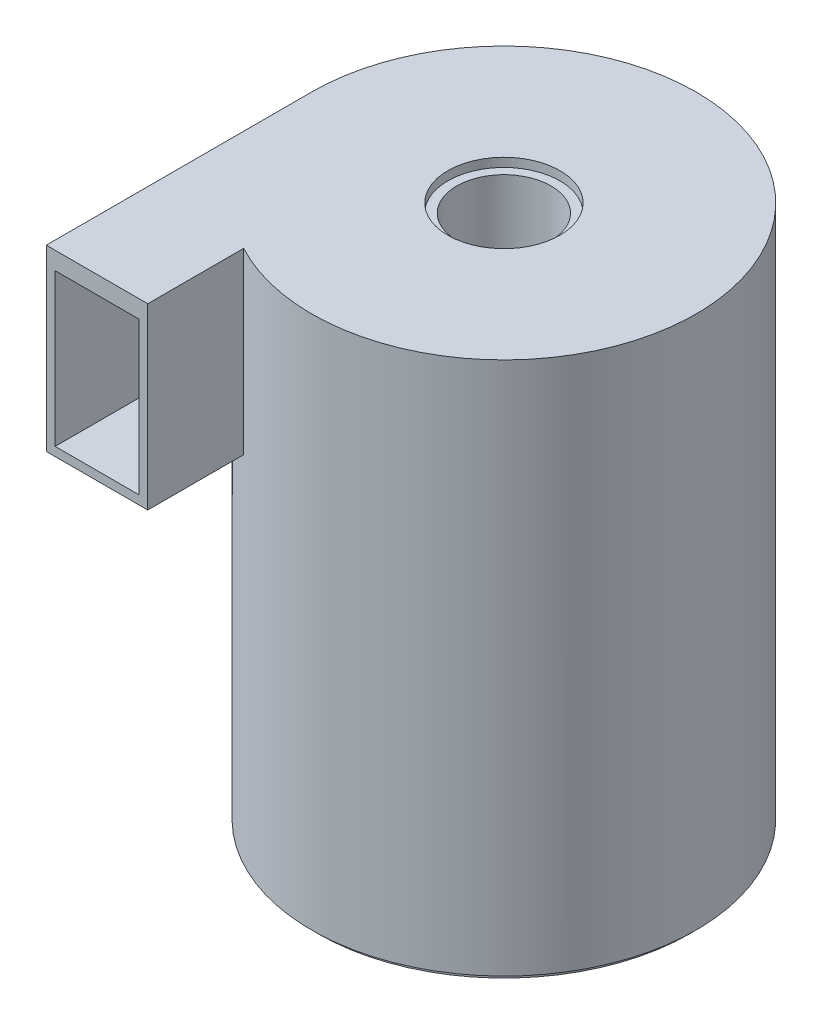
ISO-10303-21;
HEADER;
FILE_DESCRIPTION(('STEP AP214'),'2;1');
FILE_NAME('part.step','',(''),(''),'','','');
FILE_SCHEMA(('AUTOMOTIVE_DESIGN { 1 0 10303 214 1 1 1 1 }'));
ENDSEC;
DATA;
#1=APPLICATION_CONTEXT('core data for automotive mechanical design processes');
#2=APPLICATION_PROTOCOL_DEFINITION('international standard','automotive_design',2000,#1);
#3=PRODUCT_CONTEXT('',#1,'mechanical');
#4=PRODUCT('Part','Part','',(#3));
#5=PRODUCT_RELATED_PRODUCT_CATEGORY('part','',(#4));
#6=PRODUCT_DEFINITION_FORMATION('','',#4);
#7=PRODUCT_DEFINITION_CONTEXT('part definition',#1,'design');
#8=PRODUCT_DEFINITION('design','',#6,#7);
#9=PRODUCT_DEFINITION_SHAPE('','',#8);
#10=(LENGTH_UNIT() NAMED_UNIT(*) SI_UNIT(.MILLI.,.METRE.));
#11=(NAMED_UNIT(*) PLANE_ANGLE_UNIT() SI_UNIT($,.RADIAN.));
#12=(NAMED_UNIT(*) SI_UNIT($,.STERADIAN.) SOLID_ANGLE_UNIT());
#13=UNCERTAINTY_MEASURE_WITH_UNIT(LENGTH_MEASURE(1.E-05),#10,'distance_accuracy_value','');
#14=(GEOMETRIC_REPRESENTATION_CONTEXT(3) GLOBAL_UNCERTAINTY_ASSIGNED_CONTEXT((#13)) GLOBAL_UNIT_ASSIGNED_CONTEXT((#10,
#11,#12)) REPRESENTATION_CONTEXT('',''));
#15=CARTESIAN_POINT('',(0.,0.,0.));
#16=DIRECTION('',(0.,0.,1.));
#17=DIRECTION('',(1.,0.,0.));
#18=AXIS2_PLACEMENT_3D('',#15,#16,#17);
#19=CARTESIAN_POINT('',(0.,0.,0.));
#20=DIRECTION('',(0.,-1.,0.));
#21=DIRECTION('',(0.,0.,-1.));
#22=AXIS2_PLACEMENT_3D('',#19,#20,#21);
#23=CYLINDRICAL_SURFACE('',#22,65.2);
#24=DIRECTION('',(0.,-1.,0.));
#25=VECTOR('',#24,1.);
#26=CARTESIAN_POINT('',(-65.2,180.,0.));
#27=LINE('',#26,#25);
#28=CARTESIAN_POINT('',(-65.2,183.,0.));
#29=VERTEX_POINT('',#28);
#30=CARTESIAN_POINT('',(-65.2,122.4,0.));
#31=VERTEX_POINT('',#30);
#32=EDGE_CURVE('E211',#29,#31,#27,.T.);
#33=ORIENTED_EDGE('',*,*,#32,.F.);
#34=CARTESIAN_POINT('',(0.,183.,0.));
#35=DIRECTION('',(0.,1.,0.));
#36=DIRECTION('',(0.,0.,1.));
#37=AXIS2_PLACEMENT_3D('',#34,#35,#36);
#38=CIRCLE('',#37,65.2);
#39=CARTESIAN_POINT('',(-30.8,183.,57.4665119874175));
#40=VERTEX_POINT('',#39);
#41=EDGE_CURVE('E136',#40,#29,#38,.T.);
#42=ORIENTED_EDGE('',*,*,#41,.F.);
#43=DIRECTION('',(0.,-1.,0.));
#44=VECTOR('',#43,1.);
#45=CARTESIAN_POINT('',(-30.8,0.,57.4665119874175));
#46=LINE('',#45,#44);
#47=CARTESIAN_POINT('',(-30.8,122.4,57.4665119874176));
#48=VERTEX_POINT('',#47);
#49=EDGE_CURVE('E12',#40,#48,#46,.T.);
#50=ORIENTED_EDGE('',*,*,#49,.T.);
#51=CARTESIAN_POINT('',(0.,122.4,0.));
#52=DIRECTION('',(0.,1.,0.));
#53=DIRECTION('',(0.,0.,1.));
#54=AXIS2_PLACEMENT_3D('',#51,#52,#53);
#55=CIRCLE('',#54,65.2);
#56=EDGE_CURVE('E60',#48,#31,#55,.F.);
#57=ORIENTED_EDGE('',*,*,#56,.T.);
#58=EDGE_LOOP('',(#33,#42,#50,#57));
#59=FACE_BOUND('',#58,.T.);
#60=CARTESIAN_POINT('',(0.,2.,0.));
#61=DIRECTION('',(0.,-1.,0.));
#62=DIRECTION('',(0.,0.,-1.));
#63=AXIS2_PLACEMENT_3D('',#60,#61,#62);
#64=CIRCLE('',#63,65.2);
#65=CARTESIAN_POINT('',(0.,2.,-65.2));
#66=VERTEX_POINT('',#65);
#67=EDGE_CURVE('E264',#66,#66,#64,.T.);
#68=ORIENTED_EDGE('',*,*,#67,.F.);
#69=EDGE_LOOP('',(#68));
#70=FACE_BOUND('',#69,.T.);
#71=ADVANCED_FACE('F50',(#59,#70),#23,.T.);
#72=CARTESIAN_POINT('',(65.2,0.,0.));
#73=DIRECTION('',(0.,-1.,0.));
#74=DIRECTION('',(0.,0.,-1.));
#75=AXIS2_PLACEMENT_3D('',#72,#73,#74);
#76=PLANE('',#75);
#77=CARTESIAN_POINT('',(0.,0.,0.));
#78=DIRECTION('',(0.,-1.,0.));
#79=DIRECTION('',(0.,0.,-1.));
#80=AXIS2_PLACEMENT_3D('',#77,#78,#79);
#81=CIRCLE('',#80,62.2);
#82=CARTESIAN_POINT('',(0.,0.,-62.2));
#83=VERTEX_POINT('',#82);
#84=EDGE_CURVE('E161',#83,#83,#81,.T.);
#85=ORIENTED_EDGE('',*,*,#84,.F.);
#86=EDGE_LOOP('',(#85));
#87=FACE_BOUND('',#86,.T.);
#88=CARTESIAN_POINT('',(0.,0.,0.));
#89=DIRECTION('',(0.,-1.,0.));
#90=DIRECTION('',(0.,0.,-1.));
#91=AXIS2_PLACEMENT_3D('',#88,#89,#90);
#92=CIRCLE('',#91,63.2);
#93=CARTESIAN_POINT('',(0.,0.,-63.2));
#94=VERTEX_POINT('',#93);
#95=EDGE_CURVE('E256',#94,#94,#92,.T.);
#96=ORIENTED_EDGE('',*,*,#95,.T.);
#97=EDGE_LOOP('',(#96));
#98=FACE_BOUND('',#97,.T.);
#99=ADVANCED_FACE('F242',(#87,#98),#76,.T.);
#100=CARTESIAN_POINT('',(0.,0.,0.));
#101=DIRECTION('',(0.,-1.,0.));
#102=DIRECTION('',(0.,0.,-1.));
#103=AXIS2_PLACEMENT_3D('',#100,#101,#102);
#104=CYLINDRICAL_SURFACE('',#103,16.);
#105=CARTESIAN_POINT('',(0.,36.,0.));
#106=DIRECTION('',(0.,-1.,0.));
#107=DIRECTION('',(0.,0.,-1.));
#108=AXIS2_PLACEMENT_3D('',#105,#106,#107);
#109=CIRCLE('',#108,16.);
#110=CARTESIAN_POINT('',(0.,36.,-16.));
#111=VERTEX_POINT('',#110);
#112=EDGE_CURVE('E166',#111,#111,#109,.T.);
#113=ORIENTED_EDGE('',*,*,#112,.T.);
#114=EDGE_LOOP('',(#113));
#115=FACE_BOUND('',#114,.T.);
#116=CARTESIAN_POINT('',(0.,180.,0.));
#117=DIRECTION('',(0.,1.,0.));
#118=DIRECTION('',(0.,0.,1.));
#119=AXIS2_PLACEMENT_3D('',#116,#117,#118);
#120=CIRCLE('',#119,16.);
#121=CARTESIAN_POINT('',(0.,180.,16.));
#122=VERTEX_POINT('',#121);
#123=EDGE_CURVE('E54',#122,#122,#120,.T.);
#124=ORIENTED_EDGE('',*,*,#123,.T.);
#125=EDGE_LOOP('',(#124));
#126=FACE_BOUND('',#125,.T.);
#127=ADVANCED_FACE('F52',(#115,#126),#104,.F.);
#128=CARTESIAN_POINT('',(-65.2,180.,90.));
#129=DIRECTION('',(1.,0.,0.));
#130=DIRECTION('',(0.,0.,-1.));
#131=AXIS2_PLACEMENT_3D('',#128,#129,#130);
#132=PLANE('',#131);
#133=ORIENTED_EDGE('',*,*,#32,.T.);
#134=DIRECTION('',(0.,0.,-1.));
#135=VECTOR('',#134,1.);
#136=CARTESIAN_POINT('',(-65.2,122.4,90.));
#137=LINE('',#136,#135);
#138=CARTESIAN_POINT('',(-65.2,122.4,90.));
#139=VERTEX_POINT('',#138);
#140=EDGE_CURVE('E219',#139,#31,#137,.T.);
#141=ORIENTED_EDGE('',*,*,#140,.F.);
#142=DIRECTION('',(0.,-1.,0.));
#143=VECTOR('',#142,1.);
#144=CARTESIAN_POINT('',(-65.2,180.,90.));
#145=LINE('',#144,#143);
#146=CARTESIAN_POINT('',(-65.2,183.,90.));
#147=VERTEX_POINT('',#146);
#148=EDGE_CURVE('E208',#147,#139,#145,.T.);
#149=ORIENTED_EDGE('',*,*,#148,.F.);
#150=DIRECTION('',(0.,0.,1.));
#151=VECTOR('',#150,1.);
#152=CARTESIAN_POINT('',(-65.2,183.,0.));
#153=LINE('',#152,#151);
#154=EDGE_CURVE('E141',#29,#147,#153,.T.);
#155=ORIENTED_EDGE('',*,*,#154,.F.);
#156=EDGE_LOOP('',(#133,#141,#149,#155));
#157=FACE_BOUND('',#156,.T.);
#158=ADVANCED_FACE('F230',(#157),#132,.F.);
#159=CARTESIAN_POINT('',(-65.2,122.4,90.));
#160=DIRECTION('',(0.,1.,0.));
#161=DIRECTION('',(0.,0.,1.));
#162=AXIS2_PLACEMENT_3D('',#159,#160,#161);
#163=PLANE('',#162);
#164=ORIENTED_EDGE('',*,*,#56,.F.);
#165=DIRECTION('',(0.,0.,-1.));
#166=VECTOR('',#165,1.);
#167=CARTESIAN_POINT('',(-30.8,122.4,90.));
#168=LINE('',#167,#166);
#169=CARTESIAN_POINT('',(-30.8,122.4,90.));
#170=VERTEX_POINT('',#169);
#171=EDGE_CURVE('E127',#170,#48,#168,.T.);
#172=ORIENTED_EDGE('',*,*,#171,.F.);
#173=DIRECTION('',(1.,0.,0.));
#174=VECTOR('',#173,1.);
#175=CARTESIAN_POINT('',(-65.2,122.4,90.));
#176=LINE('',#175,#174);
#177=EDGE_CURVE('E124',#139,#170,#176,.T.);
#178=ORIENTED_EDGE('',*,*,#177,.F.);
#179=ORIENTED_EDGE('',*,*,#140,.T.);
#180=EDGE_LOOP('',(#164,#172,#178,#179));
#181=FACE_BOUND('',#180,.T.);
#182=ADVANCED_FACE('F232',(#181),#163,.F.);
#183=CARTESIAN_POINT('',(-30.8,180.,90.));
#184=DIRECTION('',(-1.,0.,0.));
#185=DIRECTION('',(0.,-1.,0.));
#186=AXIS2_PLACEMENT_3D('',#183,#184,#185);
#187=PLANE('',#186);
#188=ORIENTED_EDGE('',*,*,#49,.F.);
#189=DIRECTION('',(0.,0.,-1.));
#190=VECTOR('',#189,1.);
#191=CARTESIAN_POINT('',(-30.8,183.,90.));
#192=LINE('',#191,#190);
#193=CARTESIAN_POINT('',(-30.8,183.,90.));
#194=VERTEX_POINT('',#193);
#195=EDGE_CURVE('E130',#194,#40,#192,.T.);
#196=ORIENTED_EDGE('',*,*,#195,.F.);
#197=DIRECTION('',(0.,1.,0.));
#198=VECTOR('',#197,1.);
#199=CARTESIAN_POINT('',(-30.8,180.,90.));
#200=LINE('',#199,#198);
#201=EDGE_CURVE('E118',#170,#194,#200,.T.);
#202=ORIENTED_EDGE('',*,*,#201,.F.);
#203=ORIENTED_EDGE('',*,*,#171,.T.);
#204=EDGE_LOOP('',(#188,#196,#202,#203));
#205=FACE_BOUND('',#204,.T.);
#206=ADVANCED_FACE('F131',(#205),#187,.F.);
#207=CARTESIAN_POINT('',(0.,0.,90.));
#208=DIRECTION('',(0.,0.,1.));
#209=DIRECTION('',(1.,0.,0.));
#210=AXIS2_PLACEMENT_3D('',#207,#208,#209);
#211=PLANE('',#210);
#212=DIRECTION('',(0.,-1.,0.));
#213=VECTOR('',#212,1.);
#214=CARTESIAN_POINT('',(-62.2,180.,90.));
#215=LINE('',#214,#213);
#216=CARTESIAN_POINT('',(-62.2,177.,90.));
#217=VERTEX_POINT('',#216);
#218=CARTESIAN_POINT('',(-62.2,125.4,90.));
#219=VERTEX_POINT('',#218);
#220=EDGE_CURVE('E175',#217,#219,#215,.T.);
#221=ORIENTED_EDGE('',*,*,#220,.F.);
#222=DIRECTION('',(-1.,0.,0.));
#223=VECTOR('',#222,1.);
#224=CARTESIAN_POINT('',(0.,177.,90.));
#225=LINE('',#224,#223);
#226=CARTESIAN_POINT('',(-33.8,177.,90.));
#227=VERTEX_POINT('',#226);
#228=EDGE_CURVE('E182',#227,#217,#225,.T.);
#229=ORIENTED_EDGE('',*,*,#228,.F.);
#230=DIRECTION('',(0.,1.,0.));
#231=VECTOR('',#230,1.);
#232=CARTESIAN_POINT('',(-33.8,180.,90.));
#233=LINE('',#232,#231);
#234=CARTESIAN_POINT('',(-33.8,125.4,90.));
#235=VERTEX_POINT('',#234);
#236=EDGE_CURVE('E197',#235,#227,#233,.T.);
#237=ORIENTED_EDGE('',*,*,#236,.F.);
#238=DIRECTION('',(1.,0.,0.));
#239=VECTOR('',#238,1.);
#240=CARTESIAN_POINT('',(-65.2,125.4,90.));
#241=LINE('',#240,#239);
#242=EDGE_CURVE('E200',#219,#235,#241,.T.);
#243=ORIENTED_EDGE('',*,*,#242,.F.);
#244=EDGE_LOOP('',(#221,#229,#237,#243));
#245=FACE_BOUND('',#244,.T.);
#246=ORIENTED_EDGE('',*,*,#148,.T.);
#247=ORIENTED_EDGE('',*,*,#177,.T.);
#248=ORIENTED_EDGE('',*,*,#201,.T.);
#249=DIRECTION('',(1.,0.,0.));
#250=VECTOR('',#249,1.);
#251=CARTESIAN_POINT('',(-65.2,183.,90.));
#252=LINE('',#251,#250);
#253=EDGE_CURVE('E123',#147,#194,#252,.T.);
#254=ORIENTED_EDGE('',*,*,#253,.F.);
#255=EDGE_LOOP('',(#246,#247,#248,#254));
#256=FACE_BOUND('',#255,.T.);
#257=ADVANCED_FACE('F121',(#245,#256),#211,.T.);
#258=CARTESIAN_POINT('',(0.,36.,0.));
#259=DIRECTION('',(0.,1.,0.));
#260=DIRECTION('',(0.,0.,1.));
#261=AXIS2_PLACEMENT_3D('',#258,#259,#260);
#262=PLANE('',#261);
#263=CARTESIAN_POINT('',(0.,36.,0.));
#264=DIRECTION('',(0.,1.,0.));
#265=DIRECTION('',(0.,0.,1.));
#266=AXIS2_PLACEMENT_3D('',#263,#264,#265);
#267=CIRCLE('',#266,19.);
#268=CARTESIAN_POINT('',(0.,36.,19.));
#269=VERTEX_POINT('',#268);
#270=EDGE_CURVE('E171',#269,#269,#267,.F.);
#271=ORIENTED_EDGE('',*,*,#270,.T.);
#272=EDGE_LOOP('',(#271));
#273=FACE_BOUND('',#272,.T.);
#274=ORIENTED_EDGE('',*,*,#112,.F.);
#275=EDGE_LOOP('',(#274));
#276=FACE_BOUND('',#275,.T.);
#277=ADVANCED_FACE('F296',(#273,#276),#262,.F.);
#278=CARTESIAN_POINT('',(0.,0.,0.));
#279=DIRECTION('',(0.,-1.,0.));
#280=DIRECTION('',(0.,0.,-1.));
#281=AXIS2_PLACEMENT_3D('',#278,#279,#280);
#282=CYLINDRICAL_SURFACE('',#281,62.2);
#283=ORIENTED_EDGE('',*,*,#84,.T.);
#284=EDGE_LOOP('',(#283));
#285=FACE_BOUND('',#284,.T.);
#286=CARTESIAN_POINT('',(0.,177.,0.));
#287=DIRECTION('',(0.,1.,0.));
#288=DIRECTION('',(0.,0.,1.));
#289=AXIS2_PLACEMENT_3D('',#286,#287,#288);
#290=CIRCLE('',#289,62.2);
#291=CARTESIAN_POINT('',(-62.2,177.,0.));
#292=VERTEX_POINT('',#291);
#293=CARTESIAN_POINT('',(-33.8,177.,52.2149403906583));
#294=VERTEX_POINT('',#293);
#295=EDGE_CURVE('E157',#292,#294,#290,.F.);
#296=ORIENTED_EDGE('',*,*,#295,.F.);
#297=DIRECTION('',(0.,1.,0.));
#298=VECTOR('',#297,1.);
#299=CARTESIAN_POINT('',(-62.2,180.,0.));
#300=LINE('',#299,#298);
#301=CARTESIAN_POINT('',(-62.2,125.4,0.));
#302=VERTEX_POINT('',#301);
#303=EDGE_CURVE('E156',#292,#302,#300,.F.);
#304=ORIENTED_EDGE('',*,*,#303,.T.);
#305=CARTESIAN_POINT('',(0.,125.4,0.));
#306=DIRECTION('',(0.,1.,0.));
#307=DIRECTION('',(0.,0.,1.));
#308=AXIS2_PLACEMENT_3D('',#305,#306,#307);
#309=CIRCLE('',#308,62.2);
#310=CARTESIAN_POINT('',(-33.8,125.4,52.2149403906583));
#311=VERTEX_POINT('',#310);
#312=EDGE_CURVE('E167',#311,#302,#309,.F.);
#313=ORIENTED_EDGE('',*,*,#312,.F.);
#314=DIRECTION('',(0.,-1.,0.));
#315=VECTOR('',#314,1.);
#316=CARTESIAN_POINT('',(-33.8,177.,52.2149403906583));
#317=LINE('',#316,#315);
#318=EDGE_CURVE('E162',#294,#311,#317,.T.);
#319=ORIENTED_EDGE('',*,*,#318,.F.);
#320=EDGE_LOOP('',(#296,#304,#313,#319));
#321=FACE_BOUND('',#320,.T.);
#322=ADVANCED_FACE('F299',(#285,#321),#282,.F.);
#323=CARTESIAN_POINT('',(0.,0.,0.));
#324=DIRECTION('',(0.,-1.,0.));
#325=DIRECTION('',(0.,0.,-1.));
#326=AXIS2_PLACEMENT_3D('',#323,#324,#325);
#327=CYLINDRICAL_SURFACE('',#326,19.);
#328=ORIENTED_EDGE('',*,*,#270,.F.);
#329=EDGE_LOOP('',(#328));
#330=FACE_BOUND('',#329,.T.);
#331=CARTESIAN_POINT('',(0.,177.,0.));
#332=DIRECTION('',(0.,1.,0.));
#333=DIRECTION('',(0.,0.,1.));
#334=AXIS2_PLACEMENT_3D('',#331,#332,#333);
#335=CIRCLE('',#334,19.);
#336=CARTESIAN_POINT('',(0.,177.,19.));
#337=VERTEX_POINT('',#336);
#338=EDGE_CURVE('E160',#337,#337,#335,.F.);
#339=ORIENTED_EDGE('',*,*,#338,.T.);
#340=EDGE_LOOP('',(#339));
#341=FACE_BOUND('',#340,.T.);
#342=ADVANCED_FACE('F303',(#330,#341),#327,.T.);
#343=CARTESIAN_POINT('',(16.,177.,0.));
#344=DIRECTION('',(0.,1.,0.));
#345=DIRECTION('',(0.,0.,1.));
#346=AXIS2_PLACEMENT_3D('',#343,#344,#345);
#347=PLANE('',#346);
#348=DIRECTION('',(0.,0.,-1.));
#349=VECTOR('',#348,1.);
#350=CARTESIAN_POINT('',(-33.8,177.,90.));
#351=LINE('',#350,#349);
#352=EDGE_CURVE('E67',#227,#294,#351,.T.);
#353=ORIENTED_EDGE('',*,*,#352,.F.);
#354=ORIENTED_EDGE('',*,*,#228,.T.);
#355=DIRECTION('',(0.,0.,-1.));
#356=VECTOR('',#355,1.);
#357=CARTESIAN_POINT('',(-62.2,177.,0.));
#358=LINE('',#357,#356);
#359=EDGE_CURVE('E179',#217,#292,#358,.T.);
#360=ORIENTED_EDGE('',*,*,#359,.T.);
#361=ORIENTED_EDGE('',*,*,#295,.T.);
#362=EDGE_LOOP('',(#353,#354,#360,#361));
#363=FACE_BOUND('',#362,.T.);
#364=ORIENTED_EDGE('',*,*,#338,.F.);
#365=EDGE_LOOP('',(#364));
#366=FACE_BOUND('',#365,.T.);
#367=ADVANCED_FACE('F307',(#363,#366),#347,.F.);
#368=CARTESIAN_POINT('',(-62.2,180.,90.));
#369=DIRECTION('',(1.,0.,0.));
#370=DIRECTION('',(0.,0.,-1.));
#371=AXIS2_PLACEMENT_3D('',#368,#369,#370);
#372=PLANE('',#371);
#373=ORIENTED_EDGE('',*,*,#303,.F.);
#374=ORIENTED_EDGE('',*,*,#359,.F.);
#375=ORIENTED_EDGE('',*,*,#220,.T.);
#376=DIRECTION('',(0.,0.,-1.));
#377=VECTOR('',#376,1.);
#378=CARTESIAN_POINT('',(-62.2,125.4,90.));
#379=LINE('',#378,#377);
#380=EDGE_CURVE('E186',#219,#302,#379,.T.);
#381=ORIENTED_EDGE('',*,*,#380,.T.);
#382=EDGE_LOOP('',(#373,#374,#375,#381));
#383=FACE_BOUND('',#382,.T.);
#384=ADVANCED_FACE('F311',(#383),#372,.T.);
#385=CARTESIAN_POINT('',(-65.2,125.4,90.));
#386=DIRECTION('',(0.,1.,0.));
#387=DIRECTION('',(0.,0.,1.));
#388=AXIS2_PLACEMENT_3D('',#385,#386,#387);
#389=PLANE('',#388);
#390=ORIENTED_EDGE('',*,*,#312,.T.);
#391=ORIENTED_EDGE('',*,*,#380,.F.);
#392=ORIENTED_EDGE('',*,*,#242,.T.);
#393=DIRECTION('',(0.,0.,-1.));
#394=VECTOR('',#393,1.);
#395=CARTESIAN_POINT('',(-33.8,125.4,90.));
#396=LINE('',#395,#394);
#397=EDGE_CURVE('E178',#235,#311,#396,.T.);
#398=ORIENTED_EDGE('',*,*,#397,.T.);
#399=EDGE_LOOP('',(#390,#391,#392,#398));
#400=FACE_BOUND('',#399,.T.);
#401=ADVANCED_FACE('F291',(#400),#389,.T.);
#402=CARTESIAN_POINT('',(-33.8,180.,90.));
#403=DIRECTION('',(-1.,0.,0.));
#404=DIRECTION('',(0.,-1.,0.));
#405=AXIS2_PLACEMENT_3D('',#402,#403,#404);
#406=PLANE('',#405);
#407=ORIENTED_EDGE('',*,*,#318,.T.);
#408=ORIENTED_EDGE('',*,*,#397,.F.);
#409=ORIENTED_EDGE('',*,*,#236,.T.);
#410=ORIENTED_EDGE('',*,*,#352,.T.);
#411=EDGE_LOOP('',(#407,#408,#409,#410));
#412=FACE_BOUND('',#411,.T.);
#413=ADVANCED_FACE('F282',(#412),#406,.T.);
#414=CARTESIAN_POINT('',(0.,183.,0.));
#415=DIRECTION('',(0.,1.,0.));
#416=DIRECTION('',(0.,0.,1.));
#417=AXIS2_PLACEMENT_3D('',#414,#415,#416);
#418=PLANE('',#417);
#419=CARTESIAN_POINT('',(0.,183.,0.));
#420=DIRECTION('',(0.,1.,0.));
#421=DIRECTION('',(0.,0.,1.));
#422=AXIS2_PLACEMENT_3D('',#419,#420,#421);
#423=CIRCLE('',#422,19.);
#424=CARTESIAN_POINT('',(0.,183.,19.));
#425=VERTEX_POINT('',#424);
#426=EDGE_CURVE('E149',#425,#425,#423,.T.);
#427=ORIENTED_EDGE('',*,*,#426,.F.);
#428=EDGE_LOOP('',(#427));
#429=FACE_BOUND('',#428,.T.);
#430=ORIENTED_EDGE('',*,*,#253,.T.);
#431=ORIENTED_EDGE('',*,*,#195,.T.);
#432=ORIENTED_EDGE('',*,*,#41,.T.);
#433=ORIENTED_EDGE('',*,*,#154,.T.);
#434=EDGE_LOOP('',(#430,#431,#432,#433));
#435=FACE_BOUND('',#434,.T.);
#436=ADVANCED_FACE('F139',(#429,#435),#418,.T.);
#437=CARTESIAN_POINT('',(0.,180.,0.));
#438=DIRECTION('',(0.,1.,0.));
#439=DIRECTION('',(0.,0.,1.));
#440=AXIS2_PLACEMENT_3D('',#437,#438,#439);
#441=CYLINDRICAL_SURFACE('',#440,19.);
#442=CARTESIAN_POINT('',(0.,180.,0.));
#443=DIRECTION('',(0.,1.,0.));
#444=DIRECTION('',(0.,0.,1.));
#445=AXIS2_PLACEMENT_3D('',#442,#443,#444);
#446=CIRCLE('',#445,19.);
#447=CARTESIAN_POINT('',(0.,180.,19.));
#448=VERTEX_POINT('',#447);
#449=EDGE_CURVE('E147',#448,#448,#446,.T.);
#450=ORIENTED_EDGE('',*,*,#449,.F.);
#451=EDGE_LOOP('',(#450));
#452=FACE_BOUND('',#451,.T.);
#453=ORIENTED_EDGE('',*,*,#426,.T.);
#454=EDGE_LOOP('',(#453));
#455=FACE_BOUND('',#454,.T.);
#456=ADVANCED_FACE('F279',(#452,#455),#441,.F.);
#457=CARTESIAN_POINT('',(0.,180.,0.));
#458=DIRECTION('',(0.,1.,0.));
#459=DIRECTION('',(0.,0.,1.));
#460=AXIS2_PLACEMENT_3D('',#457,#458,#459);
#461=PLANE('',#460);
#462=ORIENTED_EDGE('',*,*,#123,.F.);
#463=EDGE_LOOP('',(#462));
#464=FACE_BOUND('',#463,.T.);
#465=ORIENTED_EDGE('',*,*,#449,.T.);
#466=EDGE_LOOP('',(#465));
#467=FACE_BOUND('',#466,.T.);
#468=ADVANCED_FACE('F288',(#464,#467),#461,.T.);
#469=CARTESIAN_POINT('',(0.,2.,0.));
#470=DIRECTION('',(0.,-1.,0.));
#471=DIRECTION('',(0.,0.,-1.));
#472=AXIS2_PLACEMENT_3D('',#469,#470,#471);
#473=PLANE('',#472);
#474=CARTESIAN_POINT('',(0.,2.,0.));
#475=DIRECTION('',(0.,-1.,0.));
#476=DIRECTION('',(0.,0.,-1.));
#477=AXIS2_PLACEMENT_3D('',#474,#475,#476);
#478=CIRCLE('',#477,63.2);
#479=CARTESIAN_POINT('',(0.,2.,-63.2));
#480=VERTEX_POINT('',#479);
#481=EDGE_CURVE('E259',#480,#480,#478,.T.);
#482=ORIENTED_EDGE('',*,*,#481,.F.);
#483=EDGE_LOOP('',(#482));
#484=FACE_BOUND('',#483,.T.);
#485=ORIENTED_EDGE('',*,*,#67,.T.);
#486=EDGE_LOOP('',(#485));
#487=FACE_BOUND('',#486,.T.);
#488=ADVANCED_FACE('F386',(#484,#487),#473,.T.);
#489=CARTESIAN_POINT('',(0.,2.,0.));
#490=DIRECTION('',(0.,-1.,0.));
#491=DIRECTION('',(0.,0.,-1.));
#492=AXIS2_PLACEMENT_3D('',#489,#490,#491);
#493=CYLINDRICAL_SURFACE('',#492,63.2);
#494=ORIENTED_EDGE('',*,*,#481,.T.);
#495=EDGE_LOOP('',(#494));
#496=FACE_BOUND('',#495,.T.);
#497=ORIENTED_EDGE('',*,*,#95,.F.);
#498=EDGE_LOOP('',(#497));
#499=FACE_BOUND('',#498,.T.);
#500=ADVANCED_FACE('F396',(#496,#499),#493,.T.);
#501=CLOSED_SHELL('',(#71,#99,#127,#158,#182,#206,#257,#277,#322,#342,#367,#384,#401,#413,#436,
#456,#468,#488,#500));
#502=MANIFOLD_SOLID_BREP('B2',#501);
#503=ADVANCED_BREP_SHAPE_REPRESENTATION('',(#18,#502),#14);
#504=SHAPE_DEFINITION_REPRESENTATION(#9,#503);
ENDSEC;
END-ISO-10303-21;
